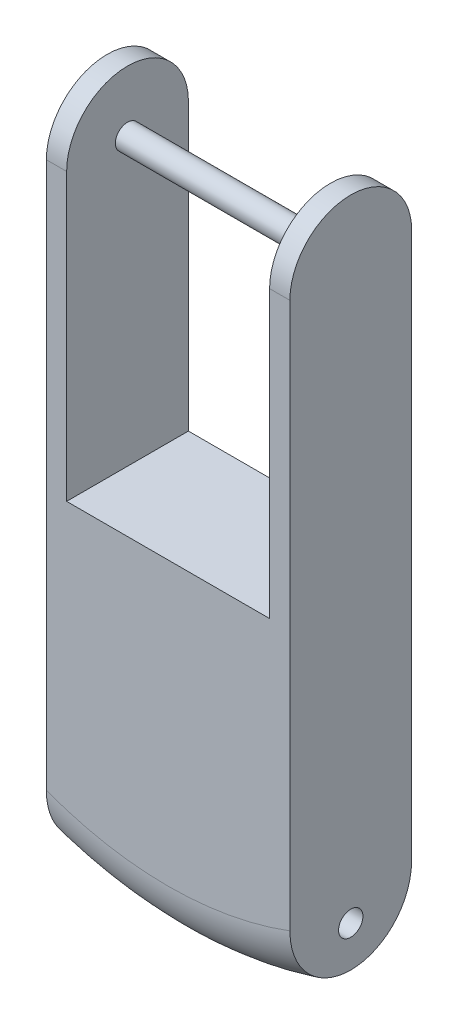
ISO-10303-21;
HEADER;
FILE_DESCRIPTION(('STEP AP214'),'2;1');
FILE_NAME('part.step','',(''),(''),'','','');
FILE_SCHEMA(('AUTOMOTIVE_DESIGN { 1 0 10303 214 1 1 1 1 }'));
ENDSEC;
DATA;
#1=APPLICATION_CONTEXT('core data for automotive mechanical design processes');
#2=APPLICATION_PROTOCOL_DEFINITION('international standard','automotive_design',2000,#1);
#3=PRODUCT_CONTEXT('',#1,'mechanical');
#4=PRODUCT('Part','Part','',(#3));
#5=PRODUCT_RELATED_PRODUCT_CATEGORY('part','',(#4));
#6=PRODUCT_DEFINITION_FORMATION('','',#4);
#7=PRODUCT_DEFINITION_CONTEXT('part definition',#1,'design');
#8=PRODUCT_DEFINITION('design','',#6,#7);
#9=PRODUCT_DEFINITION_SHAPE('','',#8);
#10=(LENGTH_UNIT() NAMED_UNIT(*) SI_UNIT(.MILLI.,.METRE.));
#11=(NAMED_UNIT(*) PLANE_ANGLE_UNIT() SI_UNIT($,.RADIAN.));
#12=(NAMED_UNIT(*) SI_UNIT($,.STERADIAN.) SOLID_ANGLE_UNIT());
#13=UNCERTAINTY_MEASURE_WITH_UNIT(LENGTH_MEASURE(1.E-05),#10,'distance_accuracy_value','');
#14=(GEOMETRIC_REPRESENTATION_CONTEXT(3) GLOBAL_UNCERTAINTY_ASSIGNED_CONTEXT((#13)) GLOBAL_UNIT_ASSIGNED_CONTEXT((#10,
#11,#12)) REPRESENTATION_CONTEXT('',''));
#15=CARTESIAN_POINT('',(0.,0.,0.));
#16=DIRECTION('',(0.,0.,1.));
#17=DIRECTION('',(1.,0.,0.));
#18=AXIS2_PLACEMENT_3D('',#15,#16,#17);
#19=CARTESIAN_POINT('',(-30.,70.,30.));
#20=DIRECTION('',(1.,0.,0.));
#21=DIRECTION('',(0.,0.,-1.));
#22=AXIS2_PLACEMENT_3D('',#19,#20,#21);
#23=PLANE('',#22);
#24=CARTESIAN_POINT('',(-30.,-85.3939201416946,15.));
#25=DIRECTION('',(1.,0.,0.));
#26=DIRECTION('',(0.,0.,-1.));
#27=AXIS2_PLACEMENT_3D('',#24,#25,#26);
#28=CIRCLE('',#27,3.);
#29=CARTESIAN_POINT('',(-30.,-85.3939201416946,12.));
#30=VERTEX_POINT('',#29);
#31=EDGE_CURVE('E147',#30,#30,#28,.T.);
#32=ORIENTED_EDGE('',*,*,#31,.T.);
#33=EDGE_LOOP('',(#32));
#34=FACE_BOUND('',#33,.T.);
#35=DIRECTION('',(0.,-1.,0.));
#36=VECTOR('',#35,1.);
#37=CARTESIAN_POINT('',(-30.,70.,30.));
#38=LINE('',#37,#36);
#39=CARTESIAN_POINT('',(-30.,55.,30.));
#40=VERTEX_POINT('',#39);
#41=CARTESIAN_POINT('',(-30.,-79.5298686029343,30.));
#42=VERTEX_POINT('',#41);
#43=EDGE_CURVE('E128',#40,#42,#38,.T.);
#44=ORIENTED_EDGE('',*,*,#43,.F.);
#45=CARTESIAN_POINT('',(-30.,55.,15.));
#46=DIRECTION('',(1.,0.,0.));
#47=DIRECTION('',(0.,0.,1.));
#48=AXIS2_PLACEMENT_3D('',#45,#46,#47);
#49=CIRCLE('',#48,15.);
#50=CARTESIAN_POINT('',(-30.,55.,0.));
#51=VERTEX_POINT('',#50);
#52=EDGE_CURVE('E116',#51,#40,#49,.T.);
#53=ORIENTED_EDGE('',*,*,#52,.F.);
#54=DIRECTION('',(0.,-1.,0.));
#55=VECTOR('',#54,1.);
#56=CARTESIAN_POINT('',(-30.,70.,0.));
#57=LINE('',#56,#55);
#58=CARTESIAN_POINT('',(-30.,-79.5298686029343,0.));
#59=VERTEX_POINT('',#58);
#60=EDGE_CURVE('E144',#51,#59,#57,.T.);
#61=ORIENTED_EDGE('',*,*,#60,.T.);
#62=CARTESIAN_POINT('',(-30.,-79.5298686029343,0.));
#63=CARTESIAN_POINT('',(-30.,-79.9977771842262,-2.77863322965849E-05));
#64=CARTESIAN_POINT('',(-30.,-80.4656828623966,0.019166891336403));
#65=CARTESIAN_POINT('',(-30.,-81.398399592175,0.0960478205061104));
#66=CARTESIAN_POINT('',(-30.,-81.8632100874909,0.153740812203967));
#67=CARTESIAN_POINT('',(-30.,-82.7871592362173,0.307778039328012));
#68=CARTESIAN_POINT('',(-30.,-83.2462885612478,0.404178892848335));
#69=CARTESIAN_POINT('',(-30.,-83.9275018374562,0.577525024838499));
#70=CARTESIAN_POINT('',(-30.,-84.1533282023222,0.640098590499463));
#71=CARTESIAN_POINT('',(-30.,-84.602184124238,0.774799907391966));
#72=CARTESIAN_POINT('',(-30.,-84.8252128708266,0.846930360305584));
#73=CARTESIAN_POINT('',(-30.,-85.4900300491599,1.07777350288325));
#74=CARTESIAN_POINT('',(-30.,-85.9269437409962,1.25078417080534));
#75=CARTESIAN_POINT('',(-30.,-86.7840987692754,1.6340910547426));
#76=CARTESIAN_POINT('',(-30.,-87.204340859864,1.84438558185084));
#77=CARTESIAN_POINT('',(-30.,-87.8193790004094,2.18683789151136));
#78=CARTESIAN_POINT('',(-30.,-88.0218008506793,2.30546552019759));
#79=CARTESIAN_POINT('',(-30.,-88.421129845449,2.55154958411046));
#80=CARTESIAN_POINT('',(-30.,-88.6180383988515,2.67900373429465));
#81=CARTESIAN_POINT('',(-30.,-89.1999400228953,3.07440142836987));
#82=CARTESIAN_POINT('',(-30.,-89.5761776796955,3.35541837833321));
#83=CARTESIAN_POINT('',(-30.,-90.2868149220452,3.93823611558627));
#84=CARTESIAN_POINT('',(-30.,-90.6222941724069,4.23872515138081));
#85=CARTESIAN_POINT('',(-30.,-91.2654868779053,4.86812173545452));
#86=CARTESIAN_POINT('',(-30.,-91.5732008136631,5.19702879162112));
#87=CARTESIAN_POINT('',(-30.,-92.1579891887577,5.88095783480336));
#88=CARTESIAN_POINT('',(-30.,-92.4350684099228,6.23597573168336));
#89=CARTESIAN_POINT('',(-30.,-92.956012656548,6.96959983414709));
#90=CARTESIAN_POINT('',(-30.,-93.1998792549663,7.34820492139687));
#91=CARTESIAN_POINT('',(-30.,-93.6397595520137,8.10503203587604));
#92=CARTESIAN_POINT('',(-30.,-93.8376493918056,8.48216469356884));
#93=CARTESIAN_POINT('',(-30.,-94.1997912310014,9.25225197180634));
#94=CARTESIAN_POINT('',(-30.,-94.3640442738953,9.64520610108029));
#95=CARTESIAN_POINT('',(-30.,-94.6573636997285,10.4439620480929));
#96=CARTESIAN_POINT('',(-30.,-94.786436170225,10.8497616295059));
#97=CARTESIAN_POINT('',(-30.,-95.0082070844384,11.6711771781196));
#98=CARTESIAN_POINT('',(-30.,-95.1009067621569,12.0867928117887));
#99=CARTESIAN_POINT('',(-30.,-95.2460761383091,12.9078199001896));
#100=CARTESIAN_POINT('',(-30.,-95.3000086592741,13.3129731709319));
#101=CARTESIAN_POINT('',(-30.,-95.3730612580325,14.1263876367067));
#102=CARTESIAN_POINT('',(-30.,-95.3921822217577,14.534648752381));
#103=CARTESIAN_POINT('',(-30.,-95.3954334120727,15.3519570155824));
#104=CARTESIAN_POINT('',(-30.,-95.3795128074487,15.7610044438674));
#105=CARTESIAN_POINT('',(-30.,-95.3294395133714,16.3723427106621));
#106=CARTESIAN_POINT('',(-30.,-95.3083773369374,16.5757836249274));
#107=CARTESIAN_POINT('',(-30.,-95.2575709018545,16.9815785523855));
#108=CARTESIAN_POINT('',(-30.,-95.2278266421643,17.183932565448));
#109=CARTESIAN_POINT('',(-30.,-95.1937676792082,17.3855833517304));
#110=B_SPLINE_CURVE_WITH_KNOTS('',3,(#62,#63,#64,#65,#66,#67,#68,#69,#70,#71,#72,#73,#74,#75,
#76,#77,#78,#79,#80,#81,#82,#83,#84,#85,#86,#87,#88,#89,#90,#91,#92,#93,#94,#95,#96,#97,#98,#99,
#100,#101,#102,#103,#104,#105,#106,#107,#108,#109),.UNSPECIFIED.,.F.,.F.,(4,2,2,2,2,2,2,2,2,2,2,
2,2,2,2,2,2,2,2,2,2,2,2,4),(0.,1.40331457054089,2.80687489467383,4.21249573283009,
4.91531917783938,5.61834173298105,7.02625530863831,8.43410512405754,9.13776491661131,
9.84124321923422,11.2479651035917,12.5974222094869,13.9468559516241,15.2960787599291,
16.6452376464604,17.9213409782425,19.1974047163944,20.4732475073221,21.7490470096229,
22.9737389819448,24.1983997862081,25.4248382511103,26.0382614905429,26.651684803546),.UNSPECIFIED.);
#111=CARTESIAN_POINT('',(-30.,-95.3939201416946,15.));
#112=VERTEX_POINT('',#111);
#113=EDGE_CURVE('E56',#59,#112,#110,.T.);
#114=ORIENTED_EDGE('',*,*,#113,.T.);
#115=CARTESIAN_POINT('',(-30.,-95.3939201416946,15.));
#116=CARTESIAN_POINT('',(-30.,-95.3939204270302,15.2036083563022));
#117=CARTESIAN_POINT('',(-30.,-95.389573576912,15.407191333814));
#118=CARTESIAN_POINT('',(-30.,-95.3722011138947,15.8139851484594));
#119=CARTESIAN_POINT('',(-30.,-95.3591755657042,16.0171959883563));
#120=CARTESIAN_POINT('',(-30.,-95.3071162561131,16.6256499955782));
#121=CARTESIAN_POINT('',(-30.,-95.2550998059616,17.0298584185985));
#122=CARTESIAN_POINT('',(-30.,-95.1170434122736,17.8315637672997));
#123=CARTESIAN_POINT('',(-30.,-95.0310689955287,18.2290720904788));
#124=CARTESIAN_POINT('',(-30.,-94.8258481760461,19.0154166470184));
#125=CARTESIAN_POINT('',(-30.,-94.7066016802121,19.404252856111));
#126=CARTESIAN_POINT('',(-30.,-94.4358637766136,20.1705441501458));
#127=CARTESIAN_POINT('',(-30.,-94.2843707394311,20.54799865887));
#128=CARTESIAN_POINT('',(-30.,-93.950427371739,21.2889591454388));
#129=CARTESIAN_POINT('',(-30.,-93.767976296769,21.6524647875915));
#130=CARTESIAN_POINT('',(-30.,-93.3736091644085,22.3631773684881));
#131=CARTESIAN_POINT('',(-30.,-93.1616892799208,22.7103821824061));
#132=CARTESIAN_POINT('',(-30.,-92.7101159310813,23.386253624486));
#133=CARTESIAN_POINT('',(-30.,-92.4704621965544,23.714920072006));
#134=CARTESIAN_POINT('',(-30.,-91.9608699552624,24.3573170929574));
#135=CARTESIAN_POINT('',(-30.,-91.6904742850661,24.6706849411497));
#136=CARTESIAN_POINT('',(-30.,-91.1250359680894,25.2743202918752));
#137=CARTESIAN_POINT('',(-30.,-90.8299930968491,25.5645875839867));
#138=CARTESIAN_POINT('',(-30.,-90.2174923375717,26.1204058574719));
#139=CARTESIAN_POINT('',(-30.,-89.9000344849781,26.3859568779264));
#140=CARTESIAN_POINT('',(-30.,-89.2449961946483,26.8909777569864));
#141=CARTESIAN_POINT('',(-30.,-88.9074144386937,27.1304459041191));
#142=CARTESIAN_POINT('',(-30.,-88.1993526200579,27.5920062836648));
#143=CARTESIAN_POINT('',(-30.,-87.8280796329281,27.8128824990042));
#144=CARTESIAN_POINT('',(-30.,-87.0688985443055,28.2238992758043));
#145=CARTESIAN_POINT('',(-30.,-86.6809899209142,28.414038872092));
#146=CARTESIAN_POINT('',(-30.,-85.8909927304483,28.7628798321485));
#147=CARTESIAN_POINT('',(-30.,-85.48889508165,28.9215606143436));
#148=CARTESIAN_POINT('',(-30.,-84.6734489800516,29.2067403731195));
#149=CARTESIAN_POINT('',(-30.,-84.2601001884383,29.3332383793687));
#150=CARTESIAN_POINT('',(-30.,-83.4024726768597,29.5595525738054));
#151=CARTESIAN_POINT('',(-30.,-82.9577216866573,29.657581113428));
#152=CARTESIAN_POINT('',(-30.,-82.0617056131584,29.8172522451932));
#153=CARTESIAN_POINT('',(-30.,-81.6104398846577,29.878891207719));
#154=CARTESIAN_POINT('',(-30.,-80.7047818056088,29.9656854681817));
#155=CARTESIAN_POINT('',(-30.,-80.2503921898471,29.9908693896978));
#156=CARTESIAN_POINT('',(-30.,-79.34112850243,30.005002498484));
#157=CARTESIAN_POINT('',(-30.,-78.8862545320802,29.9939581725864));
#158=CARTESIAN_POINT('',(-30.,-78.4325525364109,29.9648829775577));
#159=B_SPLINE_CURVE_WITH_KNOTS('',3,(#115,#116,#117,#118,#119,#120,#121,#122,#123,#124,#125,
#126,#127,#128,#129,#130,#131,#132,#133,#134,#135,#136,#137,#138,#139,#140,#141,#142,#143,#144,
#145,#146,#147,#148,#149,#150,#151,#152,#153,#154,#155,#156,#157,#158),.UNSPECIFIED.,.F.,.F.,(4,
2,2,2,2,2,2,2,2,2,2,2,2,2,2,2,2,2,2,2,2,4),(0.,0.610728074356646,1.22145159516451,
2.44246875093356,3.66114119944695,4.87981705787209,6.09855451061722,7.31732127499019,
8.53624646797839,9.75518353638309,10.995483958533,12.2357956772215,13.4761054347237,
14.7164965283208,16.0110726235442,17.305689362382,18.6011503145998,19.8966503211787,
21.2613984416565,22.6262826636442,23.9900946305688,25.3536624140967),.UNSPECIFIED.);
#160=EDGE_CURVE('E135',#112,#42,#159,.T.);
#161=ORIENTED_EDGE('',*,*,#160,.T.);
#162=EDGE_LOOP('',(#44,#53,#61,#114,#161));
#163=FACE_BOUND('',#162,.T.);
#164=ADVANCED_FACE('F47',(#34,#163),#23,.F.);
#165=CARTESIAN_POINT('',(30.,-95.3939201416946,30.));
#166=DIRECTION('',(-1.,0.,0.));
#167=DIRECTION('',(0.,0.,1.));
#168=AXIS2_PLACEMENT_3D('',#165,#166,#167);
#169=PLANE('',#168);
#170=CARTESIAN_POINT('',(30.,-85.3939201416946,15.));
#171=DIRECTION('',(1.,0.,0.));
#172=DIRECTION('',(0.,0.,-1.));
#173=AXIS2_PLACEMENT_3D('',#170,#171,#172);
#174=CIRCLE('',#173,3.);
#175=CARTESIAN_POINT('',(30.,-85.3939201416946,12.));
#176=VERTEX_POINT('',#175);
#177=EDGE_CURVE('E230',#176,#176,#174,.T.);
#178=ORIENTED_EDGE('',*,*,#177,.F.);
#179=EDGE_LOOP('',(#178));
#180=FACE_BOUND('',#179,.T.);
#181=DIRECTION('',(0.,1.,0.));
#182=VECTOR('',#181,1.);
#183=CARTESIAN_POINT('',(30.,-95.3939201416946,0.));
#184=LINE('',#183,#182);
#185=CARTESIAN_POINT('',(30.,-79.5298686029343,0.));
#186=VERTEX_POINT('',#185);
#187=CARTESIAN_POINT('',(30.,55.,0.));
#188=VERTEX_POINT('',#187);
#189=EDGE_CURVE('E138',#186,#188,#184,.T.);
#190=ORIENTED_EDGE('',*,*,#189,.T.);
#191=CARTESIAN_POINT('',(30.,55.,15.));
#192=DIRECTION('',(-1.,0.,0.));
#193=DIRECTION('',(0.,0.,1.));
#194=AXIS2_PLACEMENT_3D('',#191,#192,#193);
#195=CIRCLE('',#194,15.);
#196=CARTESIAN_POINT('',(30.,55.,30.));
#197=VERTEX_POINT('',#196);
#198=EDGE_CURVE('E163',#188,#197,#195,.F.);
#199=ORIENTED_EDGE('',*,*,#198,.T.);
#200=DIRECTION('',(0.,1.,0.));
#201=VECTOR('',#200,1.);
#202=CARTESIAN_POINT('',(30.,-95.3939201416946,30.));
#203=LINE('',#202,#201);
#204=CARTESIAN_POINT('',(30.,-79.5298686029343,30.));
#205=VERTEX_POINT('',#204);
#206=EDGE_CURVE('E137',#205,#197,#203,.T.);
#207=ORIENTED_EDGE('',*,*,#206,.F.);
#208=CARTESIAN_POINT('',(30.,-79.5298686029343,30.));
#209=CARTESIAN_POINT('',(30.,-79.9977771842263,30.0000277863323));
#210=CARTESIAN_POINT('',(30.,-80.4656828623966,29.9808331086636));
#211=CARTESIAN_POINT('',(30.,-81.398399592175,29.9039521794939));
#212=CARTESIAN_POINT('',(30.,-81.8632100874909,29.846259187796));
#213=CARTESIAN_POINT('',(30.,-82.7871592362174,29.692221960672));
#214=CARTESIAN_POINT('',(30.,-83.2462885612478,29.5958211071517));
#215=CARTESIAN_POINT('',(30.,-83.9275018374562,29.4224749751615));
#216=CARTESIAN_POINT('',(30.,-84.1533282023222,29.3599014095005));
#217=CARTESIAN_POINT('',(30.,-84.602184124238,29.225200092608));
#218=CARTESIAN_POINT('',(30.,-84.8252128708266,29.1530696396944));
#219=CARTESIAN_POINT('',(30.,-85.4900300491599,28.9222264971168));
#220=CARTESIAN_POINT('',(30.,-85.9269437409961,28.7492158291947));
#221=CARTESIAN_POINT('',(30.,-86.7840987692754,28.3659089452574));
#222=CARTESIAN_POINT('',(30.,-87.204340859864,28.1556144181492));
#223=CARTESIAN_POINT('',(30.,-87.8193790004094,27.8131621084886));
#224=CARTESIAN_POINT('',(30.,-88.0218008506793,27.6945344798024));
#225=CARTESIAN_POINT('',(30.,-88.421129845449,27.4484504158895));
#226=CARTESIAN_POINT('',(30.,-88.6180383988515,27.3209962657053));
#227=CARTESIAN_POINT('',(30.,-89.1999400228953,26.9255985716301));
#228=CARTESIAN_POINT('',(30.,-89.5761776796955,26.6445816216668));
#229=CARTESIAN_POINT('',(30.,-90.2868149220452,26.0617638844137));
#230=CARTESIAN_POINT('',(30.,-90.6222941724069,25.7612748486192));
#231=CARTESIAN_POINT('',(30.,-91.2654868779053,25.1318782645455));
#232=CARTESIAN_POINT('',(30.,-91.5732008136631,24.8029712083789));
#233=CARTESIAN_POINT('',(30.,-92.1579891887577,24.1190421651966));
#234=CARTESIAN_POINT('',(30.,-92.4350684099228,23.7640242683166));
#235=CARTESIAN_POINT('',(30.,-92.956012656548,23.0304001658529));
#236=CARTESIAN_POINT('',(30.,-93.1998792549663,22.6517950786031));
#237=CARTESIAN_POINT('',(30.,-93.6397595520137,21.894967964124));
#238=CARTESIAN_POINT('',(30.,-93.8376493918056,21.5178353064312));
#239=CARTESIAN_POINT('',(30.,-94.1997912310014,20.7477480281937));
#240=CARTESIAN_POINT('',(30.,-94.3640442738953,20.3547938989197));
#241=CARTESIAN_POINT('',(30.,-94.6573636997285,19.5560379519071));
#242=CARTESIAN_POINT('',(30.,-94.786436170225,19.1502383704941));
#243=CARTESIAN_POINT('',(30.,-95.0082070844384,18.3288228218804));
#244=CARTESIAN_POINT('',(30.,-95.1009067621569,17.9132071882113));
#245=CARTESIAN_POINT('',(30.,-95.2460761383091,17.0921800998104));
#246=CARTESIAN_POINT('',(30.,-95.3000086592741,16.6870268290681));
#247=CARTESIAN_POINT('',(30.,-95.3730612580325,15.8736123632933));
#248=CARTESIAN_POINT('',(30.,-95.3921822217577,15.4653512476189));
#249=CARTESIAN_POINT('',(30.,-95.3954334120727,14.6480429844176));
#250=CARTESIAN_POINT('',(30.,-95.3795128074487,14.2389955561326));
#251=CARTESIAN_POINT('',(30.,-95.3294395133714,13.6276572893379));
#252=CARTESIAN_POINT('',(30.,-95.3083773369374,13.4242163750726));
#253=CARTESIAN_POINT('',(30.,-95.2575709018544,13.0184214476145));
#254=CARTESIAN_POINT('',(30.,-95.2278266421643,12.816067434552));
#255=CARTESIAN_POINT('',(30.,-95.1937676792082,12.6144166482696));
#256=B_SPLINE_CURVE_WITH_KNOTS('',3,(#208,#209,#210,#211,#212,#213,#214,#215,#216,#217,#218,
#219,#220,#221,#222,#223,#224,#225,#226,#227,#228,#229,#230,#231,#232,#233,#234,#235,#236,#237,
#238,#239,#240,#241,#242,#243,#244,#245,#246,#247,#248,#249,#250,#251,#252,#253,#254,#255),
.UNSPECIFIED.,.F.,.F.,(4,2,2,2,2,2,2,2,2,2,2,2,2,2,2,2,2,2,2,2,2,2,2,4),(0.,1.40331457054091,
2.80687489467386,4.21249573283009,4.91531917783938,5.61834173298105,7.02625530863831,
8.43410512405756,9.13776491661132,9.84124321923422,11.2479651035917,12.5974222094869,
13.9468559516241,15.2960787599291,16.6452376464603,17.9213409782425,19.1974047163944,
20.4732475073221,21.7490470096229,22.9737389819448,24.1983997862081,25.4248382511103,
26.0382614905429,26.651684803546),.UNSPECIFIED.);
#257=CARTESIAN_POINT('',(30.,-95.3939201416946,15.));
#258=VERTEX_POINT('',#257);
#259=EDGE_CURVE('E165',#205,#258,#256,.T.);
#260=ORIENTED_EDGE('',*,*,#259,.T.);
#261=CARTESIAN_POINT('',(30.,-79.5298686029268,0.));
#262=CARTESIAN_POINT('',(30.,-79.9977771842188,-2.77863325046697E-05));
#263=CARTESIAN_POINT('',(30.,-80.4656828623892,0.0191668913359933));
#264=CARTESIAN_POINT('',(30.,-81.3983995921677,0.0960478205053023));
#265=CARTESIAN_POINT('',(30.,-81.8632100874836,0.153740812202961));
#266=CARTESIAN_POINT('',(30.,-82.7871592362102,0.307778039326608));
#267=CARTESIAN_POINT('',(30.,-83.2462885612407,0.40417889284673));
#268=CARTESIAN_POINT('',(30.,-83.9275018374492,0.577525024836613));
#269=CARTESIAN_POINT('',(30.,-84.1533282023152,0.640098590497488));
#270=CARTESIAN_POINT('',(30.,-84.6021841242311,0.774799907389805));
#271=CARTESIAN_POINT('',(30.,-84.8252128708198,0.846930360303326));
#272=CARTESIAN_POINT('',(30.,-85.4900300491532,1.07777350288071));
#273=CARTESIAN_POINT('',(30.,-85.9269437409896,1.25078417080263));
#274=CARTESIAN_POINT('',(30.,-86.784098769269,1.63409105473954));
#275=CARTESIAN_POINT('',(30.,-87.2043408598577,1.8443855818476));
#276=CARTESIAN_POINT('',(30.,-87.8193790004034,2.18683789150788));
#277=CARTESIAN_POINT('',(30.,-88.0218008506733,2.30546552019403));
#278=CARTESIAN_POINT('',(30.,-88.4211298454432,2.55154958410674));
#279=CARTESIAN_POINT('',(30.,-88.6180383988457,2.67900373429084));
#280=CARTESIAN_POINT('',(30.,-89.1999400228897,3.07440142836582));
#281=CARTESIAN_POINT('',(30.,-89.57617767969,3.35541837832901));
#282=CARTESIAN_POINT('',(30.,-90.2868149220401,3.9382361155818));
#283=CARTESIAN_POINT('',(30.,-90.622294172402,4.23872515137622));
#284=CARTESIAN_POINT('',(30.,-91.2654868779007,4.86812173544969));
#285=CARTESIAN_POINT('',(30.,-91.5732008136586,5.19702879161617));
#286=CARTESIAN_POINT('',(30.,-92.1579891887535,5.8809578347982));
#287=CARTESIAN_POINT('',(30.,-92.4350684099188,6.23597573167811));
#288=CARTESIAN_POINT('',(30.,-92.9560126565443,6.96959983414167));
#289=CARTESIAN_POINT('',(30.,-93.1998792549628,7.34820492139138));
#290=CARTESIAN_POINT('',(30.,-93.6397595520106,8.10503203587042));
#291=CARTESIAN_POINT('',(30.,-93.8376493918027,8.48216469356315));
#292=CARTESIAN_POINT('',(30.,-94.1997912309989,9.25225197180054));
#293=CARTESIAN_POINT('',(30.,-94.364044273893,9.64520610107444));
#294=CARTESIAN_POINT('',(30.,-94.6573636997265,10.443962048087));
#295=CARTESIAN_POINT('',(30.,-94.7864361702233,10.8497616295));
#296=CARTESIAN_POINT('',(30.,-95.008207084437,11.6711771781136));
#297=CARTESIAN_POINT('',(30.,-95.1009067621556,12.0867928117827));
#298=CARTESIAN_POINT('',(30.,-95.2460761383082,12.9078199001836));
#299=CARTESIAN_POINT('',(30.,-95.3000086592733,13.3129731709258));
#300=CARTESIAN_POINT('',(30.,-95.3730612580322,14.1263876367006));
#301=CARTESIAN_POINT('',(30.,-95.3921822217575,14.534648752375));
#302=CARTESIAN_POINT('',(30.,-95.3954334120729,15.3519570155764));
#303=CARTESIAN_POINT('',(30.,-95.379512807449,15.7610044438614));
#304=CARTESIAN_POINT('',(30.,-95.329439513372,16.3723427106562));
#305=CARTESIAN_POINT('',(30.,-95.308377336938,16.5757836249214));
#306=CARTESIAN_POINT('',(30.,-95.2575709018553,16.9815785523796));
#307=CARTESIAN_POINT('',(30.,-95.2278266421652,17.1839325654421));
#308=CARTESIAN_POINT('',(30.,-95.1937676792092,17.3855833517245));
#309=B_SPLINE_CURVE_WITH_KNOTS('',3,(#261,#262,#263,#264,#265,#266,#267,#268,#269,#270,#271,
#272,#273,#274,#275,#276,#277,#278,#279,#280,#281,#282,#283,#284,#285,#286,#287,#288,#289,#290,
#291,#292,#293,#294,#295,#296,#297,#298,#299,#300,#301,#302,#303,#304,#305,#306,#307,#308),
.UNSPECIFIED.,.F.,.F.,(4,2,2,2,2,2,2,2,2,2,2,2,2,2,2,2,2,2,2,2,2,2,2,4),(0.,1.40331457054099,
2.80687489467401,4.21249573283034,4.91531917783968,5.61834173298139,7.02625530863874,
8.43410512405806,9.13776491661187,9.84124321923482,11.2479651035924,12.5974222094877,
13.9468559516249,15.2960787599301,16.6452376464614,17.9213409782437,19.1974047163957,
20.4732475073235,21.7490470096243,22.9737389819463,24.1983997862096,25.4248382511118,
26.0382614905444,26.6516848035475),.UNSPECIFIED.);
#310=EDGE_CURVE('E188',#258,#186,#309,.F.);
#311=ORIENTED_EDGE('',*,*,#310,.T.);
#312=EDGE_LOOP('',(#190,#199,#207,#260,#311));
#313=FACE_BOUND('',#312,.T.);
#314=ADVANCED_FACE('F177',(#180,#313),#169,.F.);
#315=CARTESIAN_POINT('',(-25.,70.,-57.));
#316=DIRECTION('',(-1.,0.,0.));
#317=DIRECTION('',(0.,0.,1.));
#318=AXIS2_PLACEMENT_3D('',#315,#316,#317);
#319=PLANE('',#318);
#320=CARTESIAN_POINT('',(-25.,55.,15.));
#321=DIRECTION('',(-1.,0.,0.));
#322=DIRECTION('',(0.,0.,1.));
#323=AXIS2_PLACEMENT_3D('',#320,#321,#322);
#324=CIRCLE('',#323,3.);
#325=CARTESIAN_POINT('',(-25.,55.,12.));
#326=VERTEX_POINT('',#325);
#327=EDGE_CURVE('E162',#326,#326,#324,.T.);
#328=ORIENTED_EDGE('',*,*,#327,.T.);
#329=EDGE_LOOP('',(#328));
#330=FACE_BOUND('',#329,.T.);
#331=DIRECTION('',(0.,-1.,0.));
#332=VECTOR('',#331,1.);
#333=CARTESIAN_POINT('',(-25.,0.,0.));
#334=LINE('',#333,#332);
#335=CARTESIAN_POINT('',(-25.,55.,0.));
#336=VERTEX_POINT('',#335);
#337=CARTESIAN_POINT('',(-25.,-15.3916110221877,0.));
#338=VERTEX_POINT('',#337);
#339=EDGE_CURVE('E156',#336,#338,#334,.T.);
#340=ORIENTED_EDGE('',*,*,#339,.F.);
#341=CARTESIAN_POINT('',(-25.,55.,15.));
#342=DIRECTION('',(-1.,0.,0.));
#343=DIRECTION('',(0.,0.,1.));
#344=AXIS2_PLACEMENT_3D('',#341,#342,#343);
#345=CIRCLE('',#344,15.);
#346=CARTESIAN_POINT('',(-25.,55.,30.));
#347=VERTEX_POINT('',#346);
#348=EDGE_CURVE('E212',#336,#347,#345,.F.);
#349=ORIENTED_EDGE('',*,*,#348,.T.);
#350=DIRECTION('',(0.,-1.,0.));
#351=VECTOR('',#350,1.);
#352=CARTESIAN_POINT('',(-25.,70.,30.));
#353=LINE('',#352,#351);
#354=CARTESIAN_POINT('',(-25.,-15.3916110221877,30.));
#355=VERTEX_POINT('',#354);
#356=EDGE_CURVE('E131',#347,#355,#353,.T.);
#357=ORIENTED_EDGE('',*,*,#356,.T.);
#358=DIRECTION('',(0.,0.,1.));
#359=VECTOR('',#358,1.);
#360=CARTESIAN_POINT('',(-25.,-15.3916110221877,-57.));
#361=LINE('',#360,#359);
#362=EDGE_CURVE('E227',#338,#355,#361,.T.);
#363=ORIENTED_EDGE('',*,*,#362,.F.);
#364=EDGE_LOOP('',(#340,#349,#357,#363));
#365=FACE_BOUND('',#364,.T.);
#366=ADVANCED_FACE('F181',(#330,#365),#319,.F.);
#367=CARTESIAN_POINT('',(25.,-15.3916110221877,-57.));
#368=DIRECTION('',(1.,0.,0.));
#369=DIRECTION('',(0.,0.,-1.));
#370=AXIS2_PLACEMENT_3D('',#367,#368,#369);
#371=PLANE('',#370);
#372=CARTESIAN_POINT('',(25.,55.,15.));
#373=DIRECTION('',(1.,0.,0.));
#374=DIRECTION('',(0.,0.,-1.));
#375=AXIS2_PLACEMENT_3D('',#372,#373,#374);
#376=CIRCLE('',#375,3.);
#377=CARTESIAN_POINT('',(25.,55.,12.));
#378=VERTEX_POINT('',#377);
#379=EDGE_CURVE('E159',#378,#378,#376,.T.);
#380=ORIENTED_EDGE('',*,*,#379,.T.);
#381=EDGE_LOOP('',(#380));
#382=FACE_BOUND('',#381,.T.);
#383=DIRECTION('',(0.,1.,0.));
#384=VECTOR('',#383,1.);
#385=CARTESIAN_POINT('',(25.,-15.3916110221877,30.));
#386=LINE('',#385,#384);
#387=CARTESIAN_POINT('',(25.,-15.3916110221877,30.));
#388=VERTEX_POINT('',#387);
#389=CARTESIAN_POINT('',(25.,55.,30.));
#390=VERTEX_POINT('',#389);
#391=EDGE_CURVE('E222',#388,#390,#386,.T.);
#392=ORIENTED_EDGE('',*,*,#391,.T.);
#393=CARTESIAN_POINT('',(25.,55.,15.));
#394=DIRECTION('',(1.,0.,0.));
#395=DIRECTION('',(0.,0.,-1.));
#396=AXIS2_PLACEMENT_3D('',#393,#394,#395);
#397=CIRCLE('',#396,15.);
#398=CARTESIAN_POINT('',(25.,55.,0.));
#399=VERTEX_POINT('',#398);
#400=EDGE_CURVE('E13',#390,#399,#397,.F.);
#401=ORIENTED_EDGE('',*,*,#400,.T.);
#402=DIRECTION('',(0.,1.,0.));
#403=VECTOR('',#402,1.);
#404=CARTESIAN_POINT('',(25.,0.,0.));
#405=LINE('',#404,#403);
#406=CARTESIAN_POINT('',(25.,-15.3916110221877,0.));
#407=VERTEX_POINT('',#406);
#408=EDGE_CURVE('E141',#407,#399,#405,.T.);
#409=ORIENTED_EDGE('',*,*,#408,.F.);
#410=DIRECTION('',(0.,0.,1.));
#411=VECTOR('',#410,1.);
#412=CARTESIAN_POINT('',(25.,-15.3916110221877,-57.));
#413=LINE('',#412,#411);
#414=EDGE_CURVE('E226',#407,#388,#413,.T.);
#415=ORIENTED_EDGE('',*,*,#414,.T.);
#416=EDGE_LOOP('',(#392,#401,#409,#415));
#417=FACE_BOUND('',#416,.T.);
#418=ADVANCED_FACE('F263',(#382,#417),#371,.F.);
#419=CARTESIAN_POINT('',(0.,0.,15.));
#420=DIRECTION('',(0.,0.,1.));
#421=DIRECTION('',(1.,0.,0.));
#422=AXIS2_PLACEMENT_3D('',#419,#420,#421);
#423=TOROIDAL_SURFACE('',#422,85.,15.);
#424=ORIENTED_EDGE('',*,*,#310,.F.);
#425=CARTESIAN_POINT('',(0.,0.,15.));
#426=DIRECTION('',(0.,0.,1.));
#427=DIRECTION('',(1.,0.,0.));
#428=AXIS2_PLACEMENT_3D('',#425,#426,#427);
#429=CIRCLE('',#428,100.);
#430=EDGE_CURVE('E172',#258,#112,#429,.F.);
#431=ORIENTED_EDGE('',*,*,#430,.T.);
#432=ORIENTED_EDGE('',*,*,#113,.F.);
#433=CARTESIAN_POINT('',(0.,0.,0.));
#434=DIRECTION('',(0.,0.,1.));
#435=DIRECTION('',(1.,0.,0.));
#436=AXIS2_PLACEMENT_3D('',#433,#434,#435);
#437=CIRCLE('',#436,85.);
#438=EDGE_CURVE('E194',#186,#59,#437,.F.);
#439=ORIENTED_EDGE('',*,*,#438,.F.);
#440=EDGE_LOOP('',(#424,#431,#432,#439));
#441=FACE_BOUND('',#440,.T.);
#442=ADVANCED_FACE('F49',(#441),#423,.T.);
#443=CARTESIAN_POINT('',(0.,0.,15.));
#444=DIRECTION('',(0.,0.,1.));
#445=DIRECTION('',(1.,0.,0.));
#446=AXIS2_PLACEMENT_3D('',#443,#444,#445);
#447=TOROIDAL_SURFACE('',#446,85.,15.);
#448=CARTESIAN_POINT('',(0.,0.,30.));
#449=DIRECTION('',(0.,0.,1.));
#450=DIRECTION('',(1.,0.,0.));
#451=AXIS2_PLACEMENT_3D('',#448,#449,#450);
#452=CIRCLE('',#451,85.);
#453=EDGE_CURVE('E158',#42,#205,#452,.T.);
#454=ORIENTED_EDGE('',*,*,#453,.F.);
#455=ORIENTED_EDGE('',*,*,#160,.F.);
#456=ORIENTED_EDGE('',*,*,#430,.F.);
#457=ORIENTED_EDGE('',*,*,#259,.F.);
#458=EDGE_LOOP('',(#454,#455,#456,#457));
#459=FACE_BOUND('',#458,.T.);
#460=ADVANCED_FACE('F174',(#459),#447,.T.);
#461=CARTESIAN_POINT('',(0.,0.,30.));
#462=DIRECTION('',(0.,0.,1.));
#463=DIRECTION('',(1.,0.,0.));
#464=AXIS2_PLACEMENT_3D('',#461,#462,#463);
#465=PLANE('',#464);
#466=DIRECTION('',(-1.,0.,0.));
#467=VECTOR('',#466,1.);
#468=CARTESIAN_POINT('',(55.,55.,30.));
#469=LINE('',#468,#467);
#470=EDGE_CURVE('E63',#347,#40,#469,.T.);
#471=ORIENTED_EDGE('',*,*,#470,.T.);
#472=ORIENTED_EDGE('',*,*,#43,.T.);
#473=ORIENTED_EDGE('',*,*,#453,.T.);
#474=ORIENTED_EDGE('',*,*,#206,.T.);
#475=EDGE_CURVE('E132',#197,#390,#469,.T.);
#476=ORIENTED_EDGE('',*,*,#475,.T.);
#477=ORIENTED_EDGE('',*,*,#391,.F.);
#478=DIRECTION('',(1.,0.,0.));
#479=VECTOR('',#478,1.);
#480=CARTESIAN_POINT('',(-25.,-15.3916110221877,30.));
#481=LINE('',#480,#479);
#482=EDGE_CURVE('E219',#355,#388,#481,.T.);
#483=ORIENTED_EDGE('',*,*,#482,.F.);
#484=ORIENTED_EDGE('',*,*,#356,.F.);
#485=EDGE_LOOP('',(#471,#472,#473,#474,#476,#477,#483,#484));
#486=FACE_BOUND('',#485,.T.);
#487=ADVANCED_FACE('F126',(#486),#465,.T.);
#488=CARTESIAN_POINT('',(0.,0.,0.));
#489=DIRECTION('',(0.,0.,1.));
#490=DIRECTION('',(1.,0.,0.));
#491=AXIS2_PLACEMENT_3D('',#488,#489,#490);
#492=PLANE('',#491);
#493=ORIENTED_EDGE('',*,*,#60,.F.);
#494=DIRECTION('',(-1.,0.,0.));
#495=VECTOR('',#494,1.);
#496=CARTESIAN_POINT('',(55.,55.,0.));
#497=LINE('',#496,#495);
#498=EDGE_CURVE('E119',#336,#51,#497,.T.);
#499=ORIENTED_EDGE('',*,*,#498,.F.);
#500=ORIENTED_EDGE('',*,*,#339,.T.);
#501=DIRECTION('',(1.,0.,0.));
#502=VECTOR('',#501,1.);
#503=CARTESIAN_POINT('',(0.,-15.3916110221877,0.));
#504=LINE('',#503,#502);
#505=EDGE_CURVE('E153',#338,#407,#504,.T.);
#506=ORIENTED_EDGE('',*,*,#505,.T.);
#507=ORIENTED_EDGE('',*,*,#408,.T.);
#508=EDGE_CURVE('E71',#188,#399,#497,.T.);
#509=ORIENTED_EDGE('',*,*,#508,.F.);
#510=ORIENTED_EDGE('',*,*,#189,.F.);
#511=ORIENTED_EDGE('',*,*,#438,.T.);
#512=EDGE_LOOP('',(#493,#499,#500,#506,#507,#509,#510,#511));
#513=FACE_BOUND('',#512,.T.);
#514=ADVANCED_FACE('F183',(#513),#492,.F.);
#515=CARTESIAN_POINT('',(-57.,-85.3939201416946,15.));
#516=DIRECTION('',(1.,0.,0.));
#517=DIRECTION('',(0.,0.,-1.));
#518=AXIS2_PLACEMENT_3D('',#515,#516,#517);
#519=CYLINDRICAL_SURFACE('',#518,3.);
#520=ORIENTED_EDGE('',*,*,#177,.T.);
#521=EDGE_LOOP('',(#520));
#522=FACE_BOUND('',#521,.T.);
#523=ORIENTED_EDGE('',*,*,#31,.F.);
#524=EDGE_LOOP('',(#523));
#525=FACE_BOUND('',#524,.T.);
#526=ADVANCED_FACE('F238',(#522,#525),#519,.F.);
#527=CARTESIAN_POINT('',(-25.,-15.3916110221877,-57.));
#528=DIRECTION('',(0.,-1.,0.));
#529=DIRECTION('',(0.,0.,-1.));
#530=AXIS2_PLACEMENT_3D('',#527,#528,#529);
#531=PLANE('',#530);
#532=ORIENTED_EDGE('',*,*,#362,.T.);
#533=ORIENTED_EDGE('',*,*,#482,.T.);
#534=ORIENTED_EDGE('',*,*,#414,.F.);
#535=ORIENTED_EDGE('',*,*,#505,.F.);
#536=EDGE_LOOP('',(#532,#533,#534,#535));
#537=FACE_BOUND('',#536,.T.);
#538=ADVANCED_FACE('F240',(#537),#531,.F.);
#539=CARTESIAN_POINT('',(-26.,55.,15.));
#540=DIRECTION('',(1.,0.,0.));
#541=DIRECTION('',(0.,0.,-1.));
#542=AXIS2_PLACEMENT_3D('',#539,#540,#541);
#543=CYLINDRICAL_SURFACE('',#542,3.);
#544=CARTESIAN_POINT('',(25.,55.,12.));
#545=CARTESIAN_POINT('',(24.4791666666667,55.,12.));
#546=CARTESIAN_POINT('',(23.9583333333333,55.,12.));
#547=CARTESIAN_POINT('',(22.9166666666667,55.,12.));
#548=CARTESIAN_POINT('',(22.3958333333333,55.,12.));
#549=CARTESIAN_POINT('',(21.3541666666667,55.,12.));
#550=CARTESIAN_POINT('',(20.8333333333333,55.,12.));
#551=CARTESIAN_POINT('',(19.7916666666667,55.,12.));
#552=CARTESIAN_POINT('',(19.2708333333333,55.,12.));
#553=CARTESIAN_POINT('',(18.2291666666667,55.,12.));
#554=CARTESIAN_POINT('',(17.7083333333333,55.,12.));
#555=CARTESIAN_POINT('',(16.6666666666667,55.,12.));
#556=CARTESIAN_POINT('',(16.1458333333333,55.,12.));
#557=CARTESIAN_POINT('',(15.1041666666667,55.,12.));
#558=CARTESIAN_POINT('',(14.5833333333333,55.,12.));
#559=CARTESIAN_POINT('',(13.5416666666667,55.,12.));
#560=CARTESIAN_POINT('',(13.0208333333333,55.,12.));
#561=CARTESIAN_POINT('',(11.9791666666667,55.,12.));
#562=CARTESIAN_POINT('',(11.4583333333333,55.,12.));
#563=CARTESIAN_POINT('',(10.4166666666667,55.,12.));
#564=CARTESIAN_POINT('',(9.89583333333333,55.,12.));
#565=CARTESIAN_POINT('',(8.85416666666666,55.,12.));
#566=CARTESIAN_POINT('',(8.33333333333333,55.,12.));
#567=CARTESIAN_POINT('',(7.29166666666666,55.,12.));
#568=CARTESIAN_POINT('',(6.77083333333333,55.,12.));
#569=CARTESIAN_POINT('',(5.72916666666667,55.,12.));
#570=CARTESIAN_POINT('',(5.20833333333333,55.,12.));
#571=CARTESIAN_POINT('',(4.16666666666667,55.,12.));
#572=CARTESIAN_POINT('',(3.64583333333333,55.,12.));
#573=CARTESIAN_POINT('',(2.60416666666667,55.,12.));
#574=CARTESIAN_POINT('',(2.08333333333333,55.,12.));
#575=CARTESIAN_POINT('',(1.04166666666667,55.,12.));
#576=CARTESIAN_POINT('',(0.520833333333334,55.,12.));
#577=CARTESIAN_POINT('',(-0.520833333333334,55.,12.));
#578=CARTESIAN_POINT('',(-1.04166666666667,55.,12.));
#579=CARTESIAN_POINT('',(-2.08333333333333,55.,12.));
#580=CARTESIAN_POINT('',(-2.60416666666667,55.,12.));
#581=CARTESIAN_POINT('',(-3.64583333333333,55.,12.));
#582=CARTESIAN_POINT('',(-4.16666666666667,55.,12.));
#583=CARTESIAN_POINT('',(-5.20833333333333,55.,12.));
#584=CARTESIAN_POINT('',(-5.72916666666667,55.,12.));
#585=CARTESIAN_POINT('',(-6.77083333333334,55.,12.));
#586=CARTESIAN_POINT('',(-7.29166666666667,55.,12.));
#587=CARTESIAN_POINT('',(-8.33333333333334,55.,12.));
#588=CARTESIAN_POINT('',(-8.85416666666667,55.,12.));
#589=CARTESIAN_POINT('',(-9.89583333333334,55.,12.));
#590=CARTESIAN_POINT('',(-10.4166666666667,55.,12.));
#591=CARTESIAN_POINT('',(-11.4583333333333,55.,12.));
#592=CARTESIAN_POINT('',(-11.9791666666667,55.,12.));
#593=CARTESIAN_POINT('',(-13.0208333333333,55.,12.));
#594=CARTESIAN_POINT('',(-13.5416666666667,55.,12.));
#595=CARTESIAN_POINT('',(-14.5833333333333,55.,12.));
#596=CARTESIAN_POINT('',(-15.1041666666667,55.,12.));
#597=CARTESIAN_POINT('',(-16.1458333333333,55.,12.));
#598=CARTESIAN_POINT('',(-16.6666666666667,55.,12.));
#599=CARTESIAN_POINT('',(-17.7083333333333,55.,12.));
#600=CARTESIAN_POINT('',(-18.2291666666667,55.,12.));
#601=CARTESIAN_POINT('',(-19.2708333333333,55.,12.));
#602=CARTESIAN_POINT('',(-19.7916666666667,55.,12.));
#603=CARTESIAN_POINT('',(-20.8333333333333,55.,12.));
#604=CARTESIAN_POINT('',(-21.3541666666667,55.,12.));
#605=CARTESIAN_POINT('',(-22.3958333333333,55.,12.));
#606=CARTESIAN_POINT('',(-22.9166666666667,55.,12.));
#607=CARTESIAN_POINT('',(-23.9583333333333,55.,12.));
#608=CARTESIAN_POINT('',(-24.4791666666667,55.,12.));
#609=CARTESIAN_POINT('',(-25.,55.,12.));
#610=B_SPLINE_CURVE_WITH_KNOTS('',3,(#544,#545,#546,#547,#548,#549,#550,#551,#552,#553,#554,
#555,#556,#557,#558,#559,#560,#561,#562,#563,#564,#565,#566,#567,#568,#569,#570,#571,#572,#573,
#574,#575,#576,#577,#578,#579,#580,#581,#582,#583,#584,#585,#586,#587,#588,#589,#590,#591,#592,
#593,#594,#595,#596,#597,#598,#599,#600,#601,#602,#603,#604,#605,#606,#607,#608,#609),
.UNSPECIFIED.,.F.,.F.,(4,2,2,2,2,2,2,2,2,2,2,2,2,2,2,2,2,2,2,2,2,2,2,2,2,2,2,2,2,2,2,2,4),(0.,
1.5625,3.125,4.6875,6.25,7.8125,9.375,10.9375,12.5,14.0625,15.625,17.1875,18.75,20.3125,21.875,
23.4375,25.,26.5625,28.125,29.6875,31.25,32.8125,34.375,35.9375,37.5,39.0625,40.625,42.1875,
43.75,45.3125,46.875,48.4375,50.),.UNSPECIFIED.);
#611=EDGE_CURVE('BSEAM246',#378,#326,#610,.T.);
#612=ORIENTED_EDGE('',*,*,#379,.F.);
#613=ORIENTED_EDGE('',*,*,#327,.F.);
#614=ORIENTED_EDGE('',*,*,#611,.T.);
#615=ORIENTED_EDGE('',*,*,#611,.F.);
#616=EDGE_LOOP('',(#612,#614,#613,#615));
#617=FACE_BOUND('',#616,.T.);
#618=ADVANCED_FACE('F246',(#617),#543,.T.);
#619=CARTESIAN_POINT('',(55.,55.,15.));
#620=DIRECTION('',(-1.,0.,0.));
#621=DIRECTION('',(0.,0.,1.));
#622=AXIS2_PLACEMENT_3D('',#619,#620,#621);
#623=CYLINDRICAL_SURFACE('',#622,15.);
#624=ORIENTED_EDGE('',*,*,#400,.F.);
#625=ORIENTED_EDGE('',*,*,#475,.F.);
#626=ORIENTED_EDGE('',*,*,#198,.F.);
#627=ORIENTED_EDGE('',*,*,#508,.T.);
#628=EDGE_LOOP('',(#624,#625,#626,#627));
#629=FACE_BOUND('',#628,.T.);
#630=ADVANCED_FACE('F297',(#629),#623,.T.);
#631=ORIENTED_EDGE('',*,*,#52,.T.);
#632=ORIENTED_EDGE('',*,*,#470,.F.);
#633=ORIENTED_EDGE('',*,*,#348,.F.);
#634=ORIENTED_EDGE('',*,*,#498,.T.);
#635=EDGE_LOOP('',(#631,#632,#633,#634));
#636=FACE_BOUND('',#635,.T.);
#637=ADVANCED_FACE('F117',(#636),#623,.T.);
#638=CLOSED_SHELL('',(#164,#314,#366,#418,#442,#460,#487,#514,#526,#538,#618,#630,#637));
#639=MANIFOLD_SOLID_BREP('B2',#638);
#640=ADVANCED_BREP_SHAPE_REPRESENTATION('',(#18,#639),#14);
#641=SHAPE_DEFINITION_REPRESENTATION(#9,#640);
ENDSEC;
END-ISO-10303-21;
